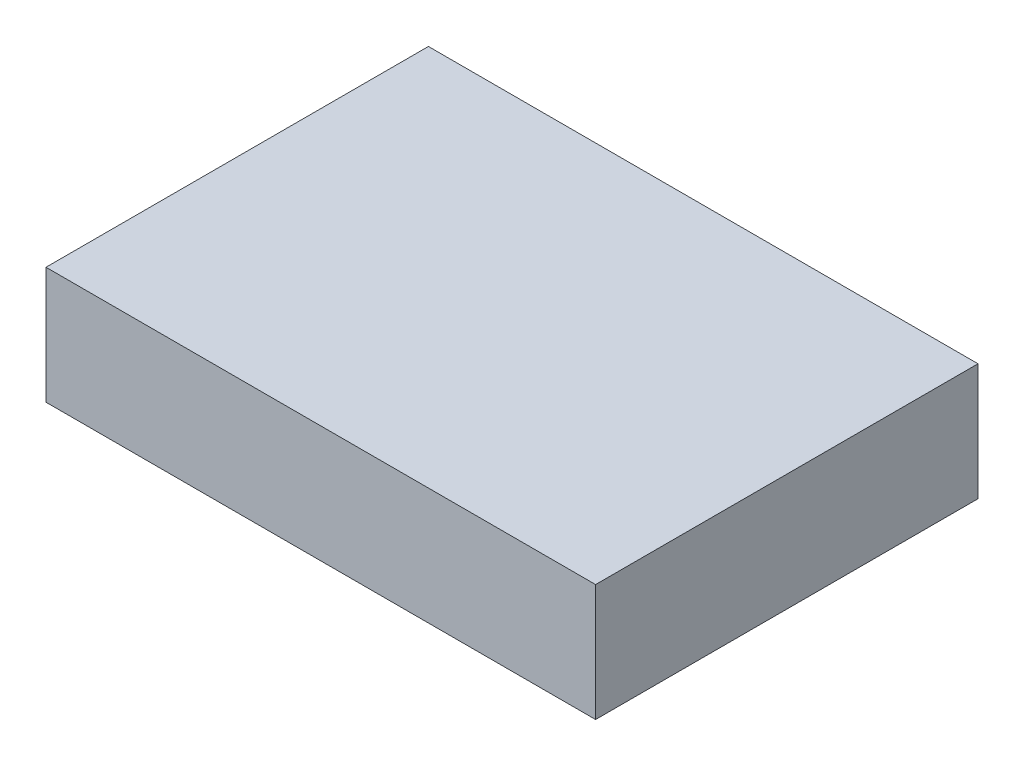
ISO-10303-21;
HEADER;
FILE_DESCRIPTION(('STEP AP214'),'2;1');
FILE_NAME('part.step','',(''),(''),'','','');
FILE_SCHEMA(('AUTOMOTIVE_DESIGN { 1 0 10303 214 1 1 1 1 }'));
ENDSEC;
DATA;
#1=APPLICATION_CONTEXT('core data for automotive mechanical design processes');
#2=APPLICATION_PROTOCOL_DEFINITION('international standard','automotive_design',2000,#1);
#3=PRODUCT_CONTEXT('',#1,'mechanical');
#4=PRODUCT('Part','Part','',(#3));
#5=PRODUCT_RELATED_PRODUCT_CATEGORY('part','',(#4));
#6=PRODUCT_DEFINITION_FORMATION('','',#4);
#7=PRODUCT_DEFINITION_CONTEXT('part definition',#1,'design');
#8=PRODUCT_DEFINITION('design','',#6,#7);
#9=PRODUCT_DEFINITION_SHAPE('','',#8);
#10=(LENGTH_UNIT() NAMED_UNIT(*) SI_UNIT(.MILLI.,.METRE.));
#11=(NAMED_UNIT(*) PLANE_ANGLE_UNIT() SI_UNIT($,.RADIAN.));
#12=(NAMED_UNIT(*) SI_UNIT($,.STERADIAN.) SOLID_ANGLE_UNIT());
#13=UNCERTAINTY_MEASURE_WITH_UNIT(LENGTH_MEASURE(1.E-05),#10,'distance_accuracy_value','');
#14=(GEOMETRIC_REPRESENTATION_CONTEXT(3) GLOBAL_UNCERTAINTY_ASSIGNED_CONTEXT((#13)) GLOBAL_UNIT_ASSIGNED_CONTEXT((#10,
#11,#12)) REPRESENTATION_CONTEXT('',''));
#15=CARTESIAN_POINT('',(0.,0.,0.));
#16=DIRECTION('',(0.,0.,1.));
#17=DIRECTION('',(1.,0.,0.));
#18=AXIS2_PLACEMENT_3D('',#15,#16,#17);
#19=CARTESIAN_POINT('',(0.,0.,350.));
#20=DIRECTION('',(1.,0.,0.));
#21=DIRECTION('',(0.,0.,-1.));
#22=AXIS2_PLACEMENT_3D('',#19,#20,#21);
#23=PLANE('',#22);
#24=DIRECTION('',(0.,-1.,0.));
#25=VECTOR('',#24,1.);
#26=CARTESIAN_POINT('',(0.,0.,0.));
#27=LINE('',#26,#25);
#28=CARTESIAN_POINT('',(0.,107.,0.));
#29=VERTEX_POINT('',#28);
#30=CARTESIAN_POINT('',(0.,0.,0.));
#31=VERTEX_POINT('',#30);
#32=EDGE_CURVE('E100',#29,#31,#27,.T.);
#33=ORIENTED_EDGE('',*,*,#32,.T.);
#34=DIRECTION('',(0.,0.,-1.));
#35=VECTOR('',#34,1.);
#36=CARTESIAN_POINT('',(0.,0.,350.));
#37=LINE('',#36,#35);
#38=CARTESIAN_POINT('',(0.,0.,350.));
#39=VERTEX_POINT('',#38);
#40=EDGE_CURVE('E91',#39,#31,#37,.T.);
#41=ORIENTED_EDGE('',*,*,#40,.F.);
#42=DIRECTION('',(0.,-1.,0.));
#43=VECTOR('',#42,1.);
#44=CARTESIAN_POINT('',(0.,0.,350.));
#45=LINE('',#44,#43);
#46=CARTESIAN_POINT('',(0.,107.,350.));
#47=VERTEX_POINT('',#46);
#48=EDGE_CURVE('E85',#47,#39,#45,.T.);
#49=ORIENTED_EDGE('',*,*,#48,.F.);
#50=DIRECTION('',(0.,0.,-1.));
#51=VECTOR('',#50,1.);
#52=CARTESIAN_POINT('',(0.,107.,350.));
#53=LINE('',#52,#51);
#54=EDGE_CURVE('E96',#47,#29,#53,.T.);
#55=ORIENTED_EDGE('',*,*,#54,.T.);
#56=EDGE_LOOP('',(#33,#41,#49,#55));
#57=FACE_BOUND('',#56,.T.);
#58=ADVANCED_FACE('F33',(#57),#23,.F.);
#59=CARTESIAN_POINT('',(0.,0.,350.));
#60=DIRECTION('',(0.,1.,0.));
#61=DIRECTION('',(0.,0.,1.));
#62=AXIS2_PLACEMENT_3D('',#59,#60,#61);
#63=PLANE('',#62);
#64=CARTESIAN_POINT('',(84.3995659148759,0.,75.4712301699595));
#65=DIRECTION('',(0.,1.,0.));
#66=DIRECTION('',(0.,0.,1.));
#67=AXIS2_PLACEMENT_3D('',#64,#65,#66);
#68=CIRCLE('',#67,19.);
#69=CARTESIAN_POINT('',(84.3995659148759,0.,94.4712301699595));
#70=VERTEX_POINT('',#69);
#71=EDGE_CURVE('E11',#70,#70,#68,.F.);
#72=ORIENTED_EDGE('',*,*,#71,.F.);
#73=EDGE_LOOP('',(#72));
#74=FACE_BOUND('',#73,.T.);
#75=CARTESIAN_POINT('',(403.747062166446,0.,75.4712301699595));
#76=DIRECTION('',(0.,1.,0.));
#77=DIRECTION('',(0.,0.,1.));
#78=AXIS2_PLACEMENT_3D('',#75,#76,#77);
#79=CIRCLE('',#78,19.);
#80=CARTESIAN_POINT('',(403.747062166446,0.,94.4712301699596));
#81=VERTEX_POINT('',#80);
#82=EDGE_CURVE('E41',#81,#81,#79,.F.);
#83=ORIENTED_EDGE('',*,*,#82,.F.);
#84=EDGE_LOOP('',(#83));
#85=FACE_BOUND('',#84,.T.);
#86=CARTESIAN_POINT('',(403.747062166446,0.,294.555551983669));
#87=DIRECTION('',(0.,1.,0.));
#88=DIRECTION('',(0.,0.,1.));
#89=AXIS2_PLACEMENT_3D('',#86,#87,#88);
#90=CIRCLE('',#89,19.);
#91=CARTESIAN_POINT('',(403.747062166446,0.,313.555551983669));
#92=VERTEX_POINT('',#91);
#93=EDGE_CURVE('E113',#92,#92,#90,.F.);
#94=ORIENTED_EDGE('',*,*,#93,.F.);
#95=EDGE_LOOP('',(#94));
#96=FACE_BOUND('',#95,.T.);
#97=CARTESIAN_POINT('',(84.3995659148759,0.,294.555551983669));
#98=DIRECTION('',(0.,1.,0.));
#99=DIRECTION('',(0.,0.,1.));
#100=AXIS2_PLACEMENT_3D('',#97,#98,#99);
#101=CIRCLE('',#100,19.);
#102=CARTESIAN_POINT('',(84.3995659148759,0.,313.555551983669));
#103=VERTEX_POINT('',#102);
#104=EDGE_CURVE('E110',#103,#103,#101,.F.);
#105=ORIENTED_EDGE('',*,*,#104,.F.);
#106=EDGE_LOOP('',(#105));
#107=FACE_BOUND('',#106,.T.);
#108=DIRECTION('',(1.,0.,0.));
#109=VECTOR('',#108,1.);
#110=CARTESIAN_POINT('',(0.,0.,0.));
#111=LINE('',#110,#109);
#112=CARTESIAN_POINT('',(503.,0.,0.));
#113=VERTEX_POINT('',#112);
#114=EDGE_CURVE('E90',#31,#113,#111,.T.);
#115=ORIENTED_EDGE('',*,*,#114,.T.);
#116=DIRECTION('',(0.,0.,-1.));
#117=VECTOR('',#116,1.);
#118=CARTESIAN_POINT('',(503.,0.,350.));
#119=LINE('',#118,#117);
#120=CARTESIAN_POINT('',(503.,0.,350.));
#121=VERTEX_POINT('',#120);
#122=EDGE_CURVE('E88',#121,#113,#119,.T.);
#123=ORIENTED_EDGE('',*,*,#122,.F.);
#124=DIRECTION('',(1.,0.,0.));
#125=VECTOR('',#124,1.);
#126=CARTESIAN_POINT('',(0.,0.,350.));
#127=LINE('',#126,#125);
#128=EDGE_CURVE('E80',#39,#121,#127,.T.);
#129=ORIENTED_EDGE('',*,*,#128,.F.);
#130=ORIENTED_EDGE('',*,*,#40,.T.);
#131=EDGE_LOOP('',(#115,#123,#129,#130));
#132=FACE_BOUND('',#131,.T.);
#133=ADVANCED_FACE('F89',(#74,#85,#96,#107,#132),#63,.F.);
#134=CARTESIAN_POINT('',(503.,0.,350.));
#135=DIRECTION('',(-1.,0.,0.));
#136=DIRECTION('',(0.,0.,1.));
#137=AXIS2_PLACEMENT_3D('',#134,#135,#136);
#138=PLANE('',#137);
#139=DIRECTION('',(0.,1.,0.));
#140=VECTOR('',#139,1.);
#141=CARTESIAN_POINT('',(503.,0.,0.));
#142=LINE('',#141,#140);
#143=CARTESIAN_POINT('',(503.,107.,0.));
#144=VERTEX_POINT('',#143);
#145=EDGE_CURVE('E66',#113,#144,#142,.T.);
#146=ORIENTED_EDGE('',*,*,#145,.T.);
#147=DIRECTION('',(0.,0.,-1.));
#148=VECTOR('',#147,1.);
#149=CARTESIAN_POINT('',(503.,107.,350.));
#150=LINE('',#149,#148);
#151=CARTESIAN_POINT('',(503.,107.,350.));
#152=VERTEX_POINT('',#151);
#153=EDGE_CURVE('E92',#152,#144,#150,.T.);
#154=ORIENTED_EDGE('',*,*,#153,.F.);
#155=DIRECTION('',(0.,1.,0.));
#156=VECTOR('',#155,1.);
#157=CARTESIAN_POINT('',(503.,0.,350.));
#158=LINE('',#157,#156);
#159=EDGE_CURVE('E83',#121,#152,#158,.T.);
#160=ORIENTED_EDGE('',*,*,#159,.F.);
#161=ORIENTED_EDGE('',*,*,#122,.T.);
#162=EDGE_LOOP('',(#146,#154,#160,#161));
#163=FACE_BOUND('',#162,.T.);
#164=ADVANCED_FACE('F94',(#163),#138,.F.);
#165=CARTESIAN_POINT('',(0.,107.,350.));
#166=DIRECTION('',(0.,-1.,0.));
#167=DIRECTION('',(0.,0.,-1.));
#168=AXIS2_PLACEMENT_3D('',#165,#166,#167);
#169=PLANE('',#168);
#170=DIRECTION('',(-1.,0.,0.));
#171=VECTOR('',#170,1.);
#172=CARTESIAN_POINT('',(0.,107.,0.));
#173=LINE('',#172,#171);
#174=EDGE_CURVE('E72',#144,#29,#173,.T.);
#175=ORIENTED_EDGE('',*,*,#174,.T.);
#176=ORIENTED_EDGE('',*,*,#54,.F.);
#177=DIRECTION('',(-1.,0.,0.));
#178=VECTOR('',#177,1.);
#179=CARTESIAN_POINT('',(0.,107.,350.));
#180=LINE('',#179,#178);
#181=EDGE_CURVE('E49',#152,#47,#180,.T.);
#182=ORIENTED_EDGE('',*,*,#181,.F.);
#183=ORIENTED_EDGE('',*,*,#153,.T.);
#184=EDGE_LOOP('',(#175,#176,#182,#183));
#185=FACE_BOUND('',#184,.T.);
#186=ADVANCED_FACE('F149',(#185),#169,.F.);
#187=CARTESIAN_POINT('',(0.,0.,350.));
#188=DIRECTION('',(0.,0.,-1.));
#189=DIRECTION('',(-1.,0.,0.));
#190=AXIS2_PLACEMENT_3D('',#187,#188,#189);
#191=PLANE('',#190);
#192=ORIENTED_EDGE('',*,*,#48,.T.);
#193=ORIENTED_EDGE('',*,*,#128,.T.);
#194=ORIENTED_EDGE('',*,*,#159,.T.);
#195=ORIENTED_EDGE('',*,*,#181,.T.);
#196=EDGE_LOOP('',(#192,#193,#194,#195));
#197=FACE_BOUND('',#196,.T.);
#198=ADVANCED_FACE('F81',(#197),#191,.F.);
#199=CARTESIAN_POINT('',(0.,0.,0.));
#200=DIRECTION('',(0.,0.,-1.));
#201=DIRECTION('',(-1.,0.,0.));
#202=AXIS2_PLACEMENT_3D('',#199,#200,#201);
#203=PLANE('',#202);
#204=ORIENTED_EDGE('',*,*,#32,.F.);
#205=ORIENTED_EDGE('',*,*,#174,.F.);
#206=ORIENTED_EDGE('',*,*,#145,.F.);
#207=ORIENTED_EDGE('',*,*,#114,.F.);
#208=EDGE_LOOP('',(#204,#205,#206,#207));
#209=FACE_BOUND('',#208,.T.);
#210=ADVANCED_FACE('F130',(#209),#203,.T.);
#211=CARTESIAN_POINT('',(84.3995659148759,-25.,294.555551983669));
#212=DIRECTION('',(0.,1.,0.));
#213=DIRECTION('',(0.,0.,1.));
#214=AXIS2_PLACEMENT_3D('',#211,#212,#213);
#215=CYLINDRICAL_SURFACE('',#214,19.);
#216=CARTESIAN_POINT('',(84.3995659148759,-25.,294.555551983669));
#217=DIRECTION('',(0.,-1.,0.));
#218=DIRECTION('',(0.,0.,-1.));
#219=AXIS2_PLACEMENT_3D('',#216,#217,#218);
#220=CIRCLE('',#219,19.);
#221=CARTESIAN_POINT('',(84.3995659148759,-25.,275.555551983669));
#222=VERTEX_POINT('',#221);
#223=EDGE_CURVE('E103',#222,#222,#220,.T.);
#224=ORIENTED_EDGE('',*,*,#223,.F.);
#225=EDGE_LOOP('',(#224));
#226=FACE_BOUND('',#225,.T.);
#227=ORIENTED_EDGE('',*,*,#104,.T.);
#228=EDGE_LOOP('',(#227));
#229=FACE_BOUND('',#228,.T.);
#230=ADVANCED_FACE('F127',(#226,#229),#215,.T.);
#231=CARTESIAN_POINT('',(84.3995659148759,-25.,294.555551983669));
#232=DIRECTION('',(0.,-1.,0.));
#233=DIRECTION('',(0.,0.,-1.));
#234=AXIS2_PLACEMENT_3D('',#231,#232,#233);
#235=PLANE('',#234);
#236=ORIENTED_EDGE('',*,*,#223,.T.);
#237=EDGE_LOOP('',(#236));
#238=FACE_BOUND('',#237,.T.);
#239=ADVANCED_FACE('F129',(#238),#235,.T.);
#240=CARTESIAN_POINT('',(403.747062166446,-25.,294.555551983669));
#241=DIRECTION('',(0.,1.,0.));
#242=DIRECTION('',(0.,0.,1.));
#243=AXIS2_PLACEMENT_3D('',#240,#241,#242);
#244=CYLINDRICAL_SURFACE('',#243,19.);
#245=CARTESIAN_POINT('',(403.747062166446,-25.,294.555551983669));
#246=DIRECTION('',(0.,-1.,0.));
#247=DIRECTION('',(0.,0.,-1.));
#248=AXIS2_PLACEMENT_3D('',#245,#246,#247);
#249=CIRCLE('',#248,19.);
#250=CARTESIAN_POINT('',(403.747062166446,-25.,275.555551983669));
#251=VERTEX_POINT('',#250);
#252=EDGE_CURVE('E246',#251,#251,#249,.T.);
#253=ORIENTED_EDGE('',*,*,#252,.F.);
#254=EDGE_LOOP('',(#253));
#255=FACE_BOUND('',#254,.T.);
#256=ORIENTED_EDGE('',*,*,#93,.T.);
#257=EDGE_LOOP('',(#256));
#258=FACE_BOUND('',#257,.T.);
#259=ADVANCED_FACE('F137',(#255,#258),#244,.T.);
#260=CARTESIAN_POINT('',(403.747062166446,-25.,294.555551983669));
#261=DIRECTION('',(0.,-1.,0.));
#262=DIRECTION('',(0.,0.,-1.));
#263=AXIS2_PLACEMENT_3D('',#260,#261,#262);
#264=PLANE('',#263);
#265=ORIENTED_EDGE('',*,*,#252,.T.);
#266=EDGE_LOOP('',(#265));
#267=FACE_BOUND('',#266,.T.);
#268=ADVANCED_FACE('F187',(#267),#264,.T.);
#269=CARTESIAN_POINT('',(403.747062166446,-25.,75.4712301699595));
#270=DIRECTION('',(0.,1.,0.));
#271=DIRECTION('',(0.,0.,1.));
#272=AXIS2_PLACEMENT_3D('',#269,#270,#271);
#273=CYLINDRICAL_SURFACE('',#272,19.);
#274=CARTESIAN_POINT('',(403.747062166446,-25.,75.4712301699595));
#275=DIRECTION('',(0.,-1.,0.));
#276=DIRECTION('',(0.,0.,-1.));
#277=AXIS2_PLACEMENT_3D('',#274,#275,#276);
#278=CIRCLE('',#277,19.);
#279=CARTESIAN_POINT('',(403.747062166446,-25.,56.4712301699595));
#280=VERTEX_POINT('',#279);
#281=EDGE_CURVE('E243',#280,#280,#278,.T.);
#282=ORIENTED_EDGE('',*,*,#281,.F.);
#283=EDGE_LOOP('',(#282));
#284=FACE_BOUND('',#283,.T.);
#285=ORIENTED_EDGE('',*,*,#82,.T.);
#286=EDGE_LOOP('',(#285));
#287=FACE_BOUND('',#286,.T.);
#288=ADVANCED_FACE('F118',(#284,#287),#273,.T.);
#289=CARTESIAN_POINT('',(403.747062166446,-25.,75.4712301699595));
#290=DIRECTION('',(0.,-1.,0.));
#291=DIRECTION('',(0.,0.,-1.));
#292=AXIS2_PLACEMENT_3D('',#289,#290,#291);
#293=PLANE('',#292);
#294=ORIENTED_EDGE('',*,*,#281,.T.);
#295=EDGE_LOOP('',(#294));
#296=FACE_BOUND('',#295,.T.);
#297=ADVANCED_FACE('F206',(#296),#293,.T.);
#298=CARTESIAN_POINT('',(84.3995659148759,-25.,75.4712301699595));
#299=DIRECTION('',(0.,1.,0.));
#300=DIRECTION('',(0.,0.,1.));
#301=AXIS2_PLACEMENT_3D('',#298,#299,#300);
#302=CYLINDRICAL_SURFACE('',#301,19.);
#303=CARTESIAN_POINT('',(84.3995659148759,-25.,75.4712301699595));
#304=DIRECTION('',(0.,-1.,0.));
#305=DIRECTION('',(0.,0.,-1.));
#306=AXIS2_PLACEMENT_3D('',#303,#304,#305);
#307=CIRCLE('',#306,19.);
#308=CARTESIAN_POINT('',(84.3995659148759,-25.,56.4712301699595));
#309=VERTEX_POINT('',#308);
#310=EDGE_CURVE('E242',#309,#309,#307,.T.);
#311=ORIENTED_EDGE('',*,*,#310,.F.);
#312=EDGE_LOOP('',(#311));
#313=FACE_BOUND('',#312,.T.);
#314=ORIENTED_EDGE('',*,*,#71,.T.);
#315=EDGE_LOOP('',(#314));
#316=FACE_BOUND('',#315,.T.);
#317=ADVANCED_FACE('F216',(#313,#316),#302,.T.);
#318=CARTESIAN_POINT('',(84.3995659148759,-25.,75.4712301699595));
#319=DIRECTION('',(0.,-1.,0.));
#320=DIRECTION('',(0.,0.,-1.));
#321=AXIS2_PLACEMENT_3D('',#318,#319,#320);
#322=PLANE('',#321);
#323=ORIENTED_EDGE('',*,*,#310,.T.);
#324=EDGE_LOOP('',(#323));
#325=FACE_BOUND('',#324,.T.);
#326=ADVANCED_FACE('F226',(#325),#322,.T.);
#327=CLOSED_SHELL('',(#58,#133,#164,#186,#198,#210,#230,#239,#259,#268,#288,#297,#317,#326));
#328=MANIFOLD_SOLID_BREP('B2',#327);
#329=ADVANCED_BREP_SHAPE_REPRESENTATION('',(#18,#328),#14);
#330=SHAPE_DEFINITION_REPRESENTATION(#9,#329);
ENDSEC;
END-ISO-10303-21;
